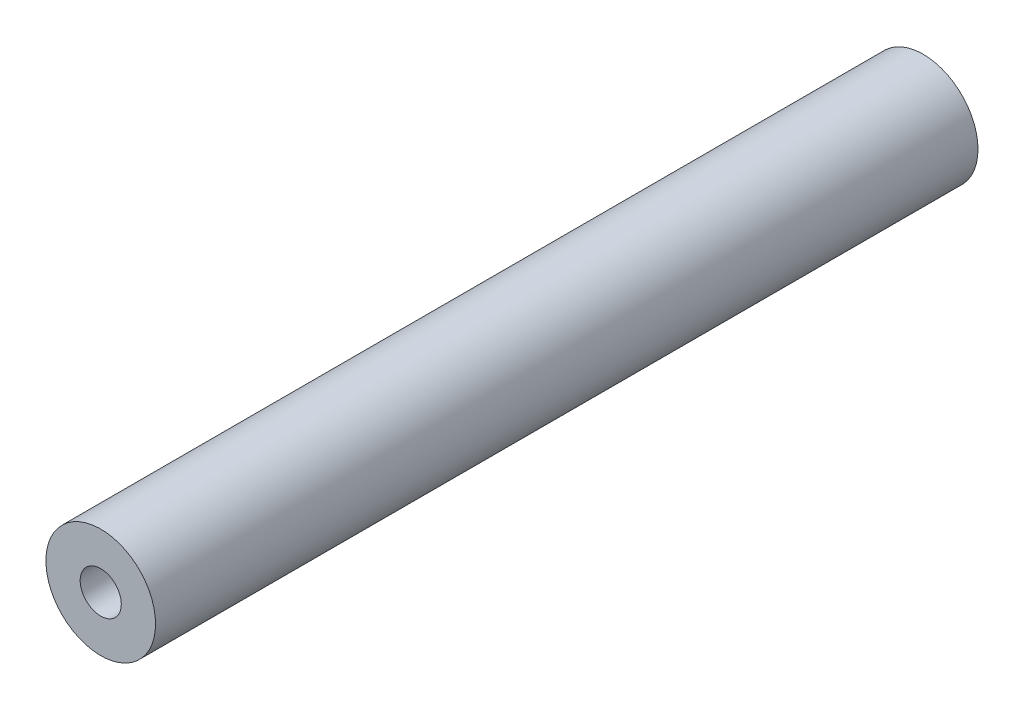
ISO-10303-21;
HEADER;
FILE_DESCRIPTION(('STEP AP214'),'2;1');
FILE_NAME('part.step','',(''),(''),'','','');
FILE_SCHEMA(('AUTOMOTIVE_DESIGN { 1 0 10303 214 1 1 1 1 }'));
ENDSEC;
DATA;
#1=APPLICATION_CONTEXT('core data for automotive mechanical design processes');
#2=APPLICATION_PROTOCOL_DEFINITION('international standard','automotive_design',2000,#1);
#3=PRODUCT_CONTEXT('',#1,'mechanical');
#4=PRODUCT('Part','Part','',(#3));
#5=PRODUCT_RELATED_PRODUCT_CATEGORY('part','',(#4));
#6=PRODUCT_DEFINITION_FORMATION('','',#4);
#7=PRODUCT_DEFINITION_CONTEXT('part definition',#1,'design');
#8=PRODUCT_DEFINITION('design','',#6,#7);
#9=PRODUCT_DEFINITION_SHAPE('','',#8);
#10=(LENGTH_UNIT() NAMED_UNIT(*) SI_UNIT(.MILLI.,.METRE.));
#11=(NAMED_UNIT(*) PLANE_ANGLE_UNIT() SI_UNIT($,.RADIAN.));
#12=(NAMED_UNIT(*) SI_UNIT($,.STERADIAN.) SOLID_ANGLE_UNIT());
#13=UNCERTAINTY_MEASURE_WITH_UNIT(LENGTH_MEASURE(1.E-05),#10,'distance_accuracy_value','');
#14=(GEOMETRIC_REPRESENTATION_CONTEXT(3) GLOBAL_UNCERTAINTY_ASSIGNED_CONTEXT((#13)) GLOBAL_UNIT_ASSIGNED_CONTEXT((#10,
#11,#12)) REPRESENTATION_CONTEXT('',''));
#15=CARTESIAN_POINT('',(0.,0.,0.));
#16=DIRECTION('',(0.,0.,1.));
#17=DIRECTION('',(1.,0.,0.));
#18=AXIS2_PLACEMENT_3D('',#15,#16,#17);
#19=CARTESIAN_POINT('',(0.,0.,60.));
#20=DIRECTION('',(0.,0.,1.));
#21=DIRECTION('',(1.,0.,0.));
#22=AXIS2_PLACEMENT_3D('',#19,#20,#21);
#23=PLANE('',#22);
#24=CARTESIAN_POINT('',(0.,0.,60.));
#25=DIRECTION('',(0.,0.,1.));
#26=DIRECTION('',(1.,0.,0.));
#27=AXIS2_PLACEMENT_3D('',#24,#25,#26);
#28=CIRCLE('',#27,4.);
#29=CARTESIAN_POINT('',(4.,0.,60.));
#30=VERTEX_POINT('',#29);
#31=EDGE_CURVE('E10',#30,#30,#28,.T.);
#32=ORIENTED_EDGE('',*,*,#31,.T.);
#33=EDGE_LOOP('',(#32));
#34=FACE_BOUND('',#33,.T.);
#35=CARTESIAN_POINT('',(0.,0.,60.));
#36=DIRECTION('',(0.,0.,1.));
#37=DIRECTION('',(1.,0.,0.));
#38=AXIS2_PLACEMENT_3D('',#35,#36,#37);
#39=CIRCLE('',#38,1.5);
#40=CARTESIAN_POINT('',(1.5,0.,60.));
#41=VERTEX_POINT('',#40);
#42=EDGE_CURVE('E48',#41,#41,#39,.T.);
#43=ORIENTED_EDGE('',*,*,#42,.F.);
#44=EDGE_LOOP('',(#43));
#45=FACE_BOUND('',#44,.T.);
#46=ADVANCED_FACE('F37',(#34,#45),#23,.T.);
#47=CARTESIAN_POINT('',(0.,0.,0.));
#48=DIRECTION('',(0.,0.,1.));
#49=DIRECTION('',(1.,0.,0.));
#50=AXIS2_PLACEMENT_3D('',#47,#48,#49);
#51=PLANE('',#50);
#52=CARTESIAN_POINT('',(0.,0.,0.));
#53=DIRECTION('',(0.,0.,1.));
#54=DIRECTION('',(1.,0.,0.));
#55=AXIS2_PLACEMENT_3D('',#52,#53,#54);
#56=CIRCLE('',#55,4.);
#57=CARTESIAN_POINT('',(4.,0.,0.));
#58=VERTEX_POINT('',#57);
#59=EDGE_CURVE('E41',#58,#58,#56,.T.);
#60=ORIENTED_EDGE('',*,*,#59,.F.);
#61=EDGE_LOOP('',(#60));
#62=FACE_BOUND('',#61,.T.);
#63=CARTESIAN_POINT('',(0.,0.,0.));
#64=DIRECTION('',(0.,0.,1.));
#65=DIRECTION('',(1.,0.,0.));
#66=AXIS2_PLACEMENT_3D('',#63,#64,#65);
#67=CIRCLE('',#66,1.5);
#68=CARTESIAN_POINT('',(1.5,0.,0.));
#69=VERTEX_POINT('',#68);
#70=EDGE_CURVE('E50',#69,#69,#67,.T.);
#71=ORIENTED_EDGE('',*,*,#70,.T.);
#72=EDGE_LOOP('',(#71));
#73=FACE_BOUND('',#72,.T.);
#74=ADVANCED_FACE('F60',(#62,#73),#51,.F.);
#75=CARTESIAN_POINT('',(0.,0.,60.));
#76=DIRECTION('',(0.,0.,-1.));
#77=DIRECTION('',(-1.,0.,0.));
#78=AXIS2_PLACEMENT_3D('',#75,#76,#77);
#79=CYLINDRICAL_SURFACE('',#78,4.);
#80=ORIENTED_EDGE('',*,*,#31,.F.);
#81=EDGE_LOOP('',(#80));
#82=FACE_BOUND('',#81,.T.);
#83=ORIENTED_EDGE('',*,*,#59,.T.);
#84=EDGE_LOOP('',(#83));
#85=FACE_BOUND('',#84,.T.);
#86=ADVANCED_FACE('F39',(#82,#85),#79,.T.);
#87=CARTESIAN_POINT('',(0.,0.,60.));
#88=DIRECTION('',(0.,0.,-1.));
#89=DIRECTION('',(-1.,0.,0.));
#90=AXIS2_PLACEMENT_3D('',#87,#88,#89);
#91=CYLINDRICAL_SURFACE('',#90,1.5);
#92=ORIENTED_EDGE('',*,*,#42,.T.);
#93=EDGE_LOOP('',(#92));
#94=FACE_BOUND('',#93,.T.);
#95=ORIENTED_EDGE('',*,*,#70,.F.);
#96=EDGE_LOOP('',(#95));
#97=FACE_BOUND('',#96,.T.);
#98=ADVANCED_FACE('F56',(#94,#97),#91,.F.);
#99=CLOSED_SHELL('',(#46,#74,#86,#98));
#100=MANIFOLD_SOLID_BREP('B2',#99);
#101=ADVANCED_BREP_SHAPE_REPRESENTATION('',(#18,#100),#14);
#102=SHAPE_DEFINITION_REPRESENTATION(#9,#101);
ENDSEC;
END-ISO-10303-21;
